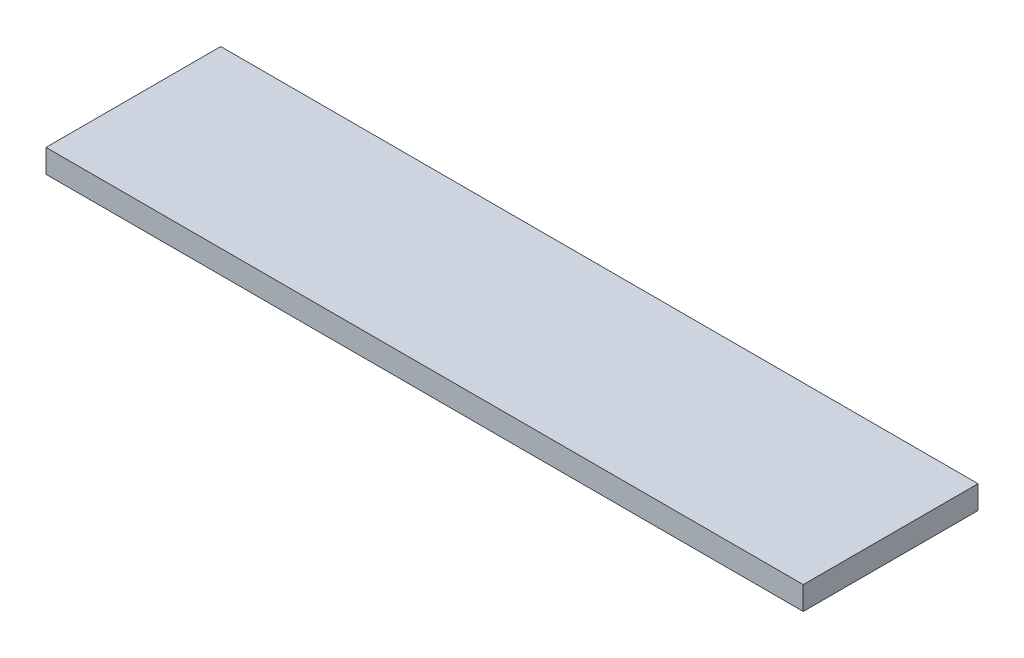
ISO-10303-21;
HEADER;
FILE_DESCRIPTION(('STEP AP214'),'2;1');
FILE_NAME('part.step','',(''),(''),'','','');
FILE_SCHEMA(('AUTOMOTIVE_DESIGN { 1 0 10303 214 1 1 1 1 }'));
ENDSEC;
DATA;
#1=APPLICATION_CONTEXT('core data for automotive mechanical design processes');
#2=APPLICATION_PROTOCOL_DEFINITION('international standard','automotive_design',2000,#1);
#3=PRODUCT_CONTEXT('',#1,'mechanical');
#4=PRODUCT('Part','Part','',(#3));
#5=PRODUCT_RELATED_PRODUCT_CATEGORY('part','',(#4));
#6=PRODUCT_DEFINITION_FORMATION('','',#4);
#7=PRODUCT_DEFINITION_CONTEXT('part definition',#1,'design');
#8=PRODUCT_DEFINITION('design','',#6,#7);
#9=PRODUCT_DEFINITION_SHAPE('','',#8);
#10=(LENGTH_UNIT() NAMED_UNIT(*) SI_UNIT(.MILLI.,.METRE.));
#11=(NAMED_UNIT(*) PLANE_ANGLE_UNIT() SI_UNIT($,.RADIAN.));
#12=(NAMED_UNIT(*) SI_UNIT($,.STERADIAN.) SOLID_ANGLE_UNIT());
#13=UNCERTAINTY_MEASURE_WITH_UNIT(LENGTH_MEASURE(1.E-05),#10,'distance_accuracy_value','');
#14=(GEOMETRIC_REPRESENTATION_CONTEXT(3) GLOBAL_UNCERTAINTY_ASSIGNED_CONTEXT((#13)) GLOBAL_UNIT_ASSIGNED_CONTEXT((#10,
#11,#12)) REPRESENTATION_CONTEXT('',''));
#15=CARTESIAN_POINT('',(0.,0.,0.));
#16=DIRECTION('',(0.,0.,1.));
#17=DIRECTION('',(1.,0.,0.));
#18=AXIS2_PLACEMENT_3D('',#15,#16,#17);
#19=CARTESIAN_POINT('',(162.5,10.,-37.5));
#20=DIRECTION('',(-1.,0.,0.));
#21=DIRECTION('',(0.,0.,1.));
#22=AXIS2_PLACEMENT_3D('',#19,#20,#21);
#23=PLANE('',#22);
#24=DIRECTION('',(0.,0.,-1.));
#25=VECTOR('',#24,1.);
#26=CARTESIAN_POINT('',(162.5,0.,-37.5));
#27=LINE('',#26,#25);
#28=CARTESIAN_POINT('',(162.5,0.,37.5));
#29=VERTEX_POINT('',#28);
#30=CARTESIAN_POINT('',(162.5,0.,-37.5));
#31=VERTEX_POINT('',#30);
#32=EDGE_CURVE('E110',#29,#31,#27,.T.);
#33=ORIENTED_EDGE('',*,*,#32,.T.);
#34=DIRECTION('',(0.,-1.,0.));
#35=VECTOR('',#34,1.);
#36=CARTESIAN_POINT('',(162.5,10.,-37.5));
#37=LINE('',#36,#35);
#38=CARTESIAN_POINT('',(162.5,10.,-37.5));
#39=VERTEX_POINT('',#38);
#40=EDGE_CURVE('E11',#39,#31,#37,.T.);
#41=ORIENTED_EDGE('',*,*,#40,.F.);
#42=DIRECTION('',(0.,0.,-1.));
#43=VECTOR('',#42,1.);
#44=CARTESIAN_POINT('',(162.5,10.,-37.5));
#45=LINE('',#44,#43);
#46=CARTESIAN_POINT('',(162.5,10.,37.5));
#47=VERTEX_POINT('',#46);
#48=EDGE_CURVE('E93',#47,#39,#45,.T.);
#49=ORIENTED_EDGE('',*,*,#48,.F.);
#50=DIRECTION('',(0.,-1.,0.));
#51=VECTOR('',#50,1.);
#52=CARTESIAN_POINT('',(162.5,10.,37.5));
#53=LINE('',#52,#51);
#54=EDGE_CURVE('E106',#47,#29,#53,.T.);
#55=ORIENTED_EDGE('',*,*,#54,.T.);
#56=EDGE_LOOP('',(#33,#41,#49,#55));
#57=FACE_BOUND('',#56,.T.);
#58=ADVANCED_FACE('F41',(#57),#23,.F.);
#59=CARTESIAN_POINT('',(-162.5,10.,-37.5));
#60=DIRECTION('',(0.,0.,1.));
#61=DIRECTION('',(1.,0.,0.));
#62=AXIS2_PLACEMENT_3D('',#59,#60,#61);
#63=PLANE('',#62);
#64=DIRECTION('',(-1.,0.,0.));
#65=VECTOR('',#64,1.);
#66=CARTESIAN_POINT('',(-162.5,0.,-37.5));
#67=LINE('',#66,#65);
#68=CARTESIAN_POINT('',(-162.5,0.,-37.5));
#69=VERTEX_POINT('',#68);
#70=EDGE_CURVE('E98',#31,#69,#67,.T.);
#71=ORIENTED_EDGE('',*,*,#70,.T.);
#72=DIRECTION('',(0.,-1.,0.));
#73=VECTOR('',#72,1.);
#74=CARTESIAN_POINT('',(-162.5,10.,-37.5));
#75=LINE('',#74,#73);
#76=CARTESIAN_POINT('',(-162.5,10.,-37.5));
#77=VERTEX_POINT('',#76);
#78=EDGE_CURVE('E50',#77,#69,#75,.T.);
#79=ORIENTED_EDGE('',*,*,#78,.F.);
#80=DIRECTION('',(-1.,0.,0.));
#81=VECTOR('',#80,1.);
#82=CARTESIAN_POINT('',(-162.5,10.,-37.5));
#83=LINE('',#82,#81);
#84=EDGE_CURVE('E88',#39,#77,#83,.T.);
#85=ORIENTED_EDGE('',*,*,#84,.F.);
#86=ORIENTED_EDGE('',*,*,#40,.T.);
#87=EDGE_LOOP('',(#71,#79,#85,#86));
#88=FACE_BOUND('',#87,.T.);
#89=ADVANCED_FACE('F97',(#88),#63,.F.);
#90=CARTESIAN_POINT('',(-162.5,10.,-37.5));
#91=DIRECTION('',(1.,0.,0.));
#92=DIRECTION('',(0.,0.,-1.));
#93=AXIS2_PLACEMENT_3D('',#90,#91,#92);
#94=PLANE('',#93);
#95=DIRECTION('',(0.,0.,1.));
#96=VECTOR('',#95,1.);
#97=CARTESIAN_POINT('',(-162.5,0.,-37.5));
#98=LINE('',#97,#96);
#99=CARTESIAN_POINT('',(-162.5,0.,37.5));
#100=VERTEX_POINT('',#99);
#101=EDGE_CURVE('E75',#69,#100,#98,.T.);
#102=ORIENTED_EDGE('',*,*,#101,.T.);
#103=DIRECTION('',(0.,-1.,0.));
#104=VECTOR('',#103,1.);
#105=CARTESIAN_POINT('',(-162.5,10.,37.5));
#106=LINE('',#105,#104);
#107=CARTESIAN_POINT('',(-162.5,10.,37.5));
#108=VERTEX_POINT('',#107);
#109=EDGE_CURVE('E100',#108,#100,#106,.T.);
#110=ORIENTED_EDGE('',*,*,#109,.F.);
#111=DIRECTION('',(0.,0.,1.));
#112=VECTOR('',#111,1.);
#113=CARTESIAN_POINT('',(-162.5,10.,-37.5));
#114=LINE('',#113,#112);
#115=EDGE_CURVE('E91',#77,#108,#114,.T.);
#116=ORIENTED_EDGE('',*,*,#115,.F.);
#117=ORIENTED_EDGE('',*,*,#78,.T.);
#118=EDGE_LOOP('',(#102,#110,#116,#117));
#119=FACE_BOUND('',#118,.T.);
#120=ADVANCED_FACE('F101',(#119),#94,.F.);
#121=CARTESIAN_POINT('',(-162.5,10.,37.5));
#122=DIRECTION('',(0.,0.,-1.));
#123=DIRECTION('',(-1.,0.,0.));
#124=AXIS2_PLACEMENT_3D('',#121,#122,#123);
#125=PLANE('',#124);
#126=DIRECTION('',(1.,0.,0.));
#127=VECTOR('',#126,1.);
#128=CARTESIAN_POINT('',(-162.5,0.,37.5));
#129=LINE('',#128,#127);
#130=EDGE_CURVE('E81',#100,#29,#129,.T.);
#131=ORIENTED_EDGE('',*,*,#130,.T.);
#132=ORIENTED_EDGE('',*,*,#54,.F.);
#133=DIRECTION('',(1.,0.,0.));
#134=VECTOR('',#133,1.);
#135=CARTESIAN_POINT('',(-162.5,10.,37.5));
#136=LINE('',#135,#134);
#137=EDGE_CURVE('E58',#108,#47,#136,.T.);
#138=ORIENTED_EDGE('',*,*,#137,.F.);
#139=ORIENTED_EDGE('',*,*,#109,.T.);
#140=EDGE_LOOP('',(#131,#132,#138,#139));
#141=FACE_BOUND('',#140,.T.);
#142=ADVANCED_FACE('F122',(#141),#125,.F.);
#143=CARTESIAN_POINT('',(0.,10.,0.));
#144=DIRECTION('',(0.,1.,0.));
#145=DIRECTION('',(0.,0.,1.));
#146=AXIS2_PLACEMENT_3D('',#143,#144,#145);
#147=PLANE('',#146);
#148=ORIENTED_EDGE('',*,*,#48,.T.);
#149=ORIENTED_EDGE('',*,*,#84,.T.);
#150=ORIENTED_EDGE('',*,*,#115,.T.);
#151=ORIENTED_EDGE('',*,*,#137,.T.);
#152=EDGE_LOOP('',(#148,#149,#150,#151));
#153=FACE_BOUND('',#152,.T.);
#154=ADVANCED_FACE('F89',(#153),#147,.T.);
#155=CARTESIAN_POINT('',(0.,0.,0.));
#156=DIRECTION('',(0.,1.,0.));
#157=DIRECTION('',(0.,0.,1.));
#158=AXIS2_PLACEMENT_3D('',#155,#156,#157);
#159=PLANE('',#158);
#160=ORIENTED_EDGE('',*,*,#32,.F.);
#161=ORIENTED_EDGE('',*,*,#130,.F.);
#162=ORIENTED_EDGE('',*,*,#101,.F.);
#163=ORIENTED_EDGE('',*,*,#70,.F.);
#164=EDGE_LOOP('',(#160,#161,#162,#163));
#165=FACE_BOUND('',#164,.T.);
#166=ADVANCED_FACE('F125',(#165),#159,.F.);
#167=CLOSED_SHELL('',(#58,#89,#120,#142,#154,#166));
#168=MANIFOLD_SOLID_BREP('B2',#167);
#169=ADVANCED_BREP_SHAPE_REPRESENTATION('',(#18,#168),#14);
#170=SHAPE_DEFINITION_REPRESENTATION(#9,#169);
ENDSEC;
END-ISO-10303-21;
